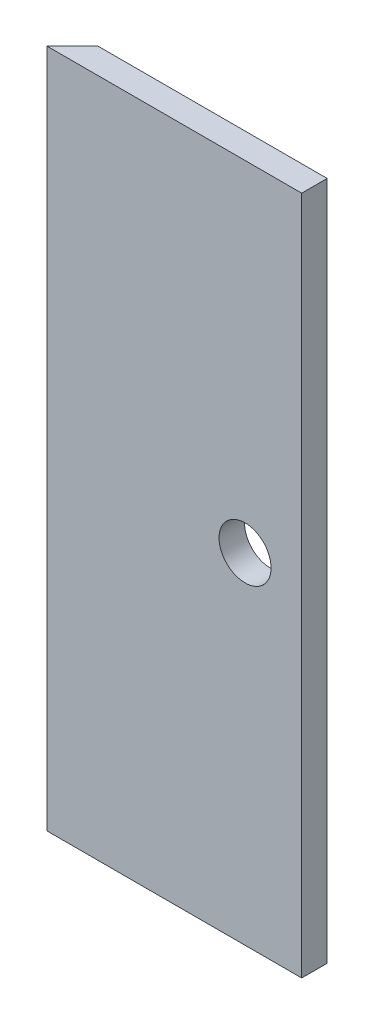
ISO-10303-21;
HEADER;
FILE_DESCRIPTION(('STEP AP214'),'2;1');
FILE_NAME('part.step','',(''),(''),'','','');
FILE_SCHEMA(('AUTOMOTIVE_DESIGN { 1 0 10303 214 1 1 1 1 }'));
ENDSEC;
DATA;
#1=APPLICATION_CONTEXT('core data for automotive mechanical design processes');
#2=APPLICATION_PROTOCOL_DEFINITION('international standard','automotive_design',2000,#1);
#3=PRODUCT_CONTEXT('',#1,'mechanical');
#4=PRODUCT('Part','Part','',(#3));
#5=PRODUCT_RELATED_PRODUCT_CATEGORY('part','',(#4));
#6=PRODUCT_DEFINITION_FORMATION('','',#4);
#7=PRODUCT_DEFINITION_CONTEXT('part definition',#1,'design');
#8=PRODUCT_DEFINITION('design','',#6,#7);
#9=PRODUCT_DEFINITION_SHAPE('','',#8);
#10=(LENGTH_UNIT() NAMED_UNIT(*) SI_UNIT(.MILLI.,.METRE.));
#11=(NAMED_UNIT(*) PLANE_ANGLE_UNIT() SI_UNIT($,.RADIAN.));
#12=(NAMED_UNIT(*) SI_UNIT($,.STERADIAN.) SOLID_ANGLE_UNIT());
#13=UNCERTAINTY_MEASURE_WITH_UNIT(LENGTH_MEASURE(1.E-05),#10,'distance_accuracy_value','');
#14=(GEOMETRIC_REPRESENTATION_CONTEXT(3) GLOBAL_UNCERTAINTY_ASSIGNED_CONTEXT((#13)) GLOBAL_UNIT_ASSIGNED_CONTEXT((#10,
#11,#12)) REPRESENTATION_CONTEXT('',''));
#15=CARTESIAN_POINT('',(0.,0.,0.));
#16=DIRECTION('',(0.,0.,1.));
#17=DIRECTION('',(1.,0.,0.));
#18=AXIS2_PLACEMENT_3D('',#15,#16,#17);
#19=CARTESIAN_POINT('',(0.,0.,18.));
#20=DIRECTION('',(0.,0.,-1.));
#21=DIRECTION('',(-1.,0.,0.));
#22=AXIS2_PLACEMENT_3D('',#19,#20,#21);
#23=PLANE('',#22);
#24=DIRECTION('',(0.,-1.,0.));
#25=VECTOR('',#24,1.);
#26=CARTESIAN_POINT('',(0.,0.,18.));
#27=LINE('',#26,#25);
#28=CARTESIAN_POINT('',(0.,480.,18.));
#29=VERTEX_POINT('',#28);
#30=CARTESIAN_POINT('',(0.,0.,18.));
#31=VERTEX_POINT('',#30);
#32=EDGE_CURVE('E75',#29,#31,#27,.T.);
#33=ORIENTED_EDGE('',*,*,#32,.T.);
#34=DIRECTION('',(1.,0.,0.));
#35=VECTOR('',#34,1.);
#36=CARTESIAN_POINT('',(0.,0.,18.));
#37=LINE('',#36,#35);
#38=CARTESIAN_POINT('',(180.,0.,18.));
#39=VERTEX_POINT('',#38);
#40=EDGE_CURVE('E79',#31,#39,#37,.T.);
#41=ORIENTED_EDGE('',*,*,#40,.T.);
#42=DIRECTION('',(0.,1.,0.));
#43=VECTOR('',#42,1.);
#44=CARTESIAN_POINT('',(180.,0.,18.));
#45=LINE('',#44,#43);
#46=CARTESIAN_POINT('',(180.,480.,18.));
#47=VERTEX_POINT('',#46);
#48=EDGE_CURVE('E84',#39,#47,#45,.T.);
#49=ORIENTED_EDGE('',*,*,#48,.T.);
#50=DIRECTION('',(-1.,0.,0.));
#51=VECTOR('',#50,1.);
#52=CARTESIAN_POINT('',(0.,480.,18.));
#53=LINE('',#52,#51);
#54=EDGE_CURVE('E89',#47,#29,#53,.T.);
#55=ORIENTED_EDGE('',*,*,#54,.T.);
#56=EDGE_LOOP('',(#33,#41,#49,#55));
#57=FACE_BOUND('',#56,.T.);
#58=CARTESIAN_POINT('',(140.,240.,18.));
#59=DIRECTION('',(0.,0.,1.));
#60=DIRECTION('',(1.,0.,0.));
#61=AXIS2_PLACEMENT_3D('',#58,#59,#60);
#62=CIRCLE('',#61,18.3687265389253);
#63=CARTESIAN_POINT('',(158.368726538925,240.,18.));
#64=VERTEX_POINT('',#63);
#65=EDGE_CURVE('E103',#64,#64,#62,.T.);
#66=ORIENTED_EDGE('',*,*,#65,.F.);
#67=EDGE_LOOP('',(#66));
#68=FACE_BOUND('',#67,.T.);
#69=ADVANCED_FACE('F34',(#57,#68),#23,.F.);
#70=CARTESIAN_POINT('',(0.,0.,0.));
#71=DIRECTION('',(0.,0.,-1.));
#72=DIRECTION('',(-1.,0.,0.));
#73=AXIS2_PLACEMENT_3D('',#70,#71,#72);
#74=PLANE('',#73);
#75=DIRECTION('',(1.,0.,0.));
#76=VECTOR('',#75,1.);
#77=CARTESIAN_POINT('',(0.,0.,0.));
#78=LINE('',#77,#76);
#79=CARTESIAN_POINT('',(18.0000000000001,0.,0.));
#80=VERTEX_POINT('',#79);
#81=CARTESIAN_POINT('',(180.,0.,0.));
#82=VERTEX_POINT('',#81);
#83=EDGE_CURVE('E101',#80,#82,#78,.T.);
#84=ORIENTED_EDGE('',*,*,#83,.F.);
#85=DIRECTION('',(0.,1.,0.));
#86=VECTOR('',#85,1.);
#87=CARTESIAN_POINT('',(18.0000000000001,480.,0.));
#88=LINE('',#87,#86);
#89=CARTESIAN_POINT('',(18.0000000000001,480.,0.));
#90=VERTEX_POINT('',#89);
#91=EDGE_CURVE('E42',#80,#90,#88,.T.);
#92=ORIENTED_EDGE('',*,*,#91,.T.);
#93=DIRECTION('',(-1.,0.,0.));
#94=VECTOR('',#93,1.);
#95=CARTESIAN_POINT('',(0.,480.,0.));
#96=LINE('',#95,#94);
#97=CARTESIAN_POINT('',(180.,480.,0.));
#98=VERTEX_POINT('',#97);
#99=EDGE_CURVE('E90',#98,#90,#96,.T.);
#100=ORIENTED_EDGE('',*,*,#99,.F.);
#101=DIRECTION('',(0.,1.,0.));
#102=VECTOR('',#101,1.);
#103=CARTESIAN_POINT('',(180.,0.,0.));
#104=LINE('',#103,#102);
#105=EDGE_CURVE('E92',#82,#98,#104,.T.);
#106=ORIENTED_EDGE('',*,*,#105,.F.);
#107=EDGE_LOOP('',(#84,#92,#100,#106));
#108=FACE_BOUND('',#107,.T.);
#109=CARTESIAN_POINT('',(140.,240.,0.));
#110=DIRECTION('',(0.,0.,1.));
#111=DIRECTION('',(1.,0.,0.));
#112=AXIS2_PLACEMENT_3D('',#109,#110,#111);
#113=CIRCLE('',#112,18.3687265389253);
#114=CARTESIAN_POINT('',(158.368726538925,240.,0.));
#115=VERTEX_POINT('',#114);
#116=EDGE_CURVE('E95',#115,#115,#113,.T.);
#117=ORIENTED_EDGE('',*,*,#116,.T.);
#118=EDGE_LOOP('',(#117));
#119=FACE_BOUND('',#118,.T.);
#120=ADVANCED_FACE('F111',(#108,#119),#74,.T.);
#121=CARTESIAN_POINT('',(0.,0.,18.));
#122=DIRECTION('',(0.,1.,0.));
#123=DIRECTION('',(-1.,0.,0.));
#124=AXIS2_PLACEMENT_3D('',#121,#122,#123);
#125=PLANE('',#124);
#126=ORIENTED_EDGE('',*,*,#40,.F.);
#127=DIRECTION('',(0.70710678118655,0.,-0.707106781186545));
#128=VECTOR('',#127,1.);
#129=CARTESIAN_POINT('',(0.,0.,18.));
#130=LINE('',#129,#128);
#131=EDGE_CURVE('E56',#31,#80,#130,.T.);
#132=ORIENTED_EDGE('',*,*,#131,.T.);
#133=ORIENTED_EDGE('',*,*,#83,.T.);
#134=DIRECTION('',(0.,0.,-1.));
#135=VECTOR('',#134,1.);
#136=CARTESIAN_POINT('',(180.,0.,18.));
#137=LINE('',#136,#135);
#138=EDGE_CURVE('E76',#39,#82,#137,.T.);
#139=ORIENTED_EDGE('',*,*,#138,.F.);
#140=EDGE_LOOP('',(#126,#132,#133,#139));
#141=FACE_BOUND('',#140,.T.);
#142=ADVANCED_FACE('F80',(#141),#125,.F.);
#143=CARTESIAN_POINT('',(180.,0.,18.));
#144=DIRECTION('',(-1.,0.,0.));
#145=DIRECTION('',(0.,-1.,0.));
#146=AXIS2_PLACEMENT_3D('',#143,#144,#145);
#147=PLANE('',#146);
#148=ORIENTED_EDGE('',*,*,#105,.T.);
#149=DIRECTION('',(0.,0.,-1.));
#150=VECTOR('',#149,1.);
#151=CARTESIAN_POINT('',(180.,480.,18.));
#152=LINE('',#151,#150);
#153=EDGE_CURVE('E100',#47,#98,#152,.T.);
#154=ORIENTED_EDGE('',*,*,#153,.F.);
#155=ORIENTED_EDGE('',*,*,#48,.F.);
#156=ORIENTED_EDGE('',*,*,#138,.T.);
#157=EDGE_LOOP('',(#148,#154,#155,#156));
#158=FACE_BOUND('',#157,.T.);
#159=ADVANCED_FACE('F109',(#158),#147,.F.);
#160=CARTESIAN_POINT('',(0.,480.,18.));
#161=DIRECTION('',(0.,-1.,0.));
#162=DIRECTION('',(0.,0.,-1.));
#163=AXIS2_PLACEMENT_3D('',#160,#161,#162);
#164=PLANE('',#163);
#165=ORIENTED_EDGE('',*,*,#99,.T.);
#166=DIRECTION('',(-0.70710678118655,0.,0.707106781186545));
#167=VECTOR('',#166,1.);
#168=CARTESIAN_POINT('',(0.,480.,18.));
#169=LINE('',#168,#167);
#170=EDGE_CURVE('E11',#90,#29,#169,.T.);
#171=ORIENTED_EDGE('',*,*,#170,.T.);
#172=ORIENTED_EDGE('',*,*,#54,.F.);
#173=ORIENTED_EDGE('',*,*,#153,.T.);
#174=EDGE_LOOP('',(#165,#171,#172,#173));
#175=FACE_BOUND('',#174,.T.);
#176=ADVANCED_FACE('F114',(#175),#164,.F.);
#177=CARTESIAN_POINT('',(140.,240.,18.));
#178=DIRECTION('',(0.,0.,-1.));
#179=DIRECTION('',(-1.,0.,0.));
#180=AXIS2_PLACEMENT_3D('',#177,#178,#179);
#181=CYLINDRICAL_SURFACE('',#180,18.3687265389253);
#182=ORIENTED_EDGE('',*,*,#65,.T.);
#183=EDGE_LOOP('',(#182));
#184=FACE_BOUND('',#183,.T.);
#185=ORIENTED_EDGE('',*,*,#116,.F.);
#186=EDGE_LOOP('',(#185));
#187=FACE_BOUND('',#186,.T.);
#188=ADVANCED_FACE('F116',(#184,#187),#181,.F.);
#189=CARTESIAN_POINT('',(0.,0.,18.));
#190=DIRECTION('',(-0.707106781186545,0.,-0.70710678118655));
#191=DIRECTION('',(0.,1.,0.));
#192=AXIS2_PLACEMENT_3D('',#189,#190,#191);
#193=PLANE('',#192);
#194=ORIENTED_EDGE('',*,*,#170,.F.);
#195=ORIENTED_EDGE('',*,*,#91,.F.);
#196=ORIENTED_EDGE('',*,*,#131,.F.);
#197=ORIENTED_EDGE('',*,*,#32,.F.);
#198=EDGE_LOOP('',(#194,#195,#196,#197));
#199=FACE_BOUND('',#198,.T.);
#200=ADVANCED_FACE('F36',(#199),#193,.T.);
#201=CLOSED_SHELL('',(#69,#120,#142,#159,#176,#188,#200));
#202=MANIFOLD_SOLID_BREP('B2',#201);
#203=ADVANCED_BREP_SHAPE_REPRESENTATION('',(#18,#202),#14);
#204=SHAPE_DEFINITION_REPRESENTATION(#9,#203);
ENDSEC;
END-ISO-10303-21;
